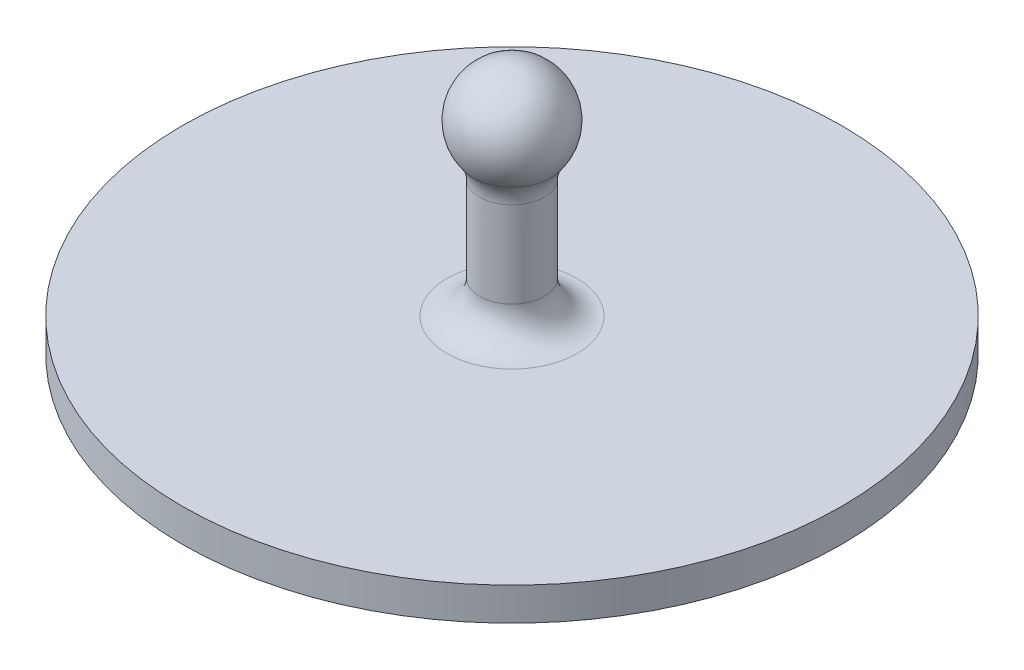
ISO-10303-21;
HEADER;
FILE_DESCRIPTION(('STEP AP214'),'2;1');
FILE_NAME('part.step','',(''),(''),'','','');
FILE_SCHEMA(('AUTOMOTIVE_DESIGN { 1 0 10303 214 1 1 1 1 }'));
ENDSEC;
DATA;
#1=APPLICATION_CONTEXT('core data for automotive mechanical design processes');
#2=APPLICATION_PROTOCOL_DEFINITION('international standard','automotive_design',2000,#1);
#3=PRODUCT_CONTEXT('',#1,'mechanical');
#4=PRODUCT('Part','Part','',(#3));
#5=PRODUCT_RELATED_PRODUCT_CATEGORY('part','',(#4));
#6=PRODUCT_DEFINITION_FORMATION('','',#4);
#7=PRODUCT_DEFINITION_CONTEXT('part definition',#1,'design');
#8=PRODUCT_DEFINITION('design','',#6,#7);
#9=PRODUCT_DEFINITION_SHAPE('','',#8);
#10=(LENGTH_UNIT() NAMED_UNIT(*) SI_UNIT(.MILLI.,.METRE.));
#11=(NAMED_UNIT(*) PLANE_ANGLE_UNIT() SI_UNIT($,.RADIAN.));
#12=(NAMED_UNIT(*) SI_UNIT($,.STERADIAN.) SOLID_ANGLE_UNIT());
#13=UNCERTAINTY_MEASURE_WITH_UNIT(LENGTH_MEASURE(1.E-05),#10,'distance_accuracy_value','');
#14=(GEOMETRIC_REPRESENTATION_CONTEXT(3) GLOBAL_UNCERTAINTY_ASSIGNED_CONTEXT((#13)) GLOBAL_UNIT_ASSIGNED_CONTEXT((#10,
#11,#12)) REPRESENTATION_CONTEXT('',''));
#15=CARTESIAN_POINT('',(0.,0.,0.));
#16=DIRECTION('',(0.,0.,1.));
#17=DIRECTION('',(1.,0.,0.));
#18=AXIS2_PLACEMENT_3D('',#15,#16,#17);
#19=CARTESIAN_POINT('',(0.,8.,0.));
#20=DIRECTION('',(0.,-1.,0.));
#21=DIRECTION('',(0.,0.,-1.));
#22=AXIS2_PLACEMENT_3D('',#19,#20,#21);
#23=CYLINDRICAL_SURFACE('',#22,1.95);
#24=CARTESIAN_POINT('',(0.,7.21152679316063,0.));
#25=DIRECTION('',(0.,1.,0.));
#26=DIRECTION('',(0.,0.,1.));
#27=AXIS2_PLACEMENT_3D('',#24,#25,#26);
#28=CIRCLE('',#27,1.95);
#29=CARTESIAN_POINT('',(0.,7.21152679316063,1.95));
#30=VERTEX_POINT('',#29);
#31=EDGE_CURVE('E46',#30,#30,#28,.F.);
#32=ORIENTED_EDGE('',*,*,#31,.T.);
#33=EDGE_LOOP('',(#32));
#34=FACE_BOUND('',#33,.T.);
#35=CARTESIAN_POINT('',(0.,2.,0.));
#36=DIRECTION('',(0.,-1.,0.));
#37=DIRECTION('',(0.,0.,-1.));
#38=AXIS2_PLACEMENT_3D('',#35,#36,#37);
#39=CIRCLE('',#38,1.95);
#40=CARTESIAN_POINT('',(0.,2.,-1.95));
#41=VERTEX_POINT('',#40);
#42=EDGE_CURVE('E49',#41,#41,#39,.F.);
#43=ORIENTED_EDGE('',*,*,#42,.T.);
#44=EDGE_LOOP('',(#43));
#45=FACE_BOUND('',#44,.T.);
#46=ADVANCED_FACE('F39',(#34,#45),#23,.T.);
#47=CARTESIAN_POINT('',(0.,10.2912735849057,0.));
#48=DIRECTION('',(0.,0.,1.));
#49=DIRECTION('',(1.,0.,0.));
#50=AXIS2_PLACEMENT_3D('',#47,#48,#49);
#51=SPHERICAL_SURFACE('',#50,3.00872641509434);
#52=CARTESIAN_POINT('',(0.,10.2912735849057,0.));
#53=DIRECTION('',(0.,1.,0.));
#54=DIRECTION('',(0.,0.,1.));
#55=AXIS2_PLACEMENT_3D('',#52,#53,#54);
#56=SPHERICAL_SURFACE('',#55,3.00872641509434);
#57=CARTESIAN_POINT('',(0.,8.44127924378915,0.));
#58=DIRECTION('',(0.,1.,0.));
#59=DIRECTION('',(0.,0.,1.));
#60=AXIS2_PLACEMENT_3D('',#57,#58,#59);
#61=CIRCLE('',#60,2.37275274285445);
#62=CARTESIAN_POINT('',(0.,8.44127924378915,2.37275274285445));
#63=VERTEX_POINT('',#62);
#64=EDGE_CURVE('E53',#63,#63,#61,.T.);
#65=ORIENTED_EDGE('',*,*,#64,.T.);
#66=EDGE_LOOP('',(#65));
#67=FACE_BOUND('',#66,.T.);
#68=ADVANCED_FACE('F86',(#67),#56,.T.);
#69=CARTESIAN_POINT('',(0.,-2.,0.));
#70=DIRECTION('',(0.,1.,0.));
#71=DIRECTION('',(0.,0.,1.));
#72=AXIS2_PLACEMENT_3D('',#69,#70,#71);
#73=CYLINDRICAL_SURFACE('',#72,20.);
#74=CARTESIAN_POINT('',(0.,-2.,0.));
#75=DIRECTION('',(0.,-1.,0.));
#76=DIRECTION('',(0.,0.,-1.));
#77=AXIS2_PLACEMENT_3D('',#74,#75,#76);
#78=CIRCLE('',#77,20.);
#79=CARTESIAN_POINT('',(0.,-2.,-20.));
#80=VERTEX_POINT('',#79);
#81=EDGE_CURVE('E56',#80,#80,#78,.T.);
#82=ORIENTED_EDGE('',*,*,#81,.F.);
#83=EDGE_LOOP('',(#82));
#84=FACE_BOUND('',#83,.T.);
#85=CARTESIAN_POINT('',(0.,0.,0.));
#86=DIRECTION('',(0.,-1.,0.));
#87=DIRECTION('',(0.,0.,-1.));
#88=AXIS2_PLACEMENT_3D('',#85,#86,#87);
#89=CIRCLE('',#88,20.);
#90=CARTESIAN_POINT('',(0.,0.,-20.));
#91=VERTEX_POINT('',#90);
#92=EDGE_CURVE('E58',#91,#91,#89,.T.);
#93=ORIENTED_EDGE('',*,*,#92,.T.);
#94=EDGE_LOOP('',(#93));
#95=FACE_BOUND('',#94,.T.);
#96=ADVANCED_FACE('F84',(#84,#95),#73,.T.);
#97=CARTESIAN_POINT('',(0.,-2.,0.));
#98=DIRECTION('',(0.,-1.,0.));
#99=DIRECTION('',(0.,0.,-1.));
#100=AXIS2_PLACEMENT_3D('',#97,#98,#99);
#101=PLANE('',#100);
#102=CARTESIAN_POINT('',(0.,-2.,0.));
#103=DIRECTION('',(0.,-1.,0.));
#104=DIRECTION('',(0.,0.,-1.));
#105=AXIS2_PLACEMENT_3D('',#102,#103,#104);
#106=CIRCLE('',#105,19.);
#107=CARTESIAN_POINT('',(0.,-2.,-19.));
#108=VERTEX_POINT('',#107);
#109=EDGE_CURVE('E68',#108,#108,#106,.T.);
#110=ORIENTED_EDGE('',*,*,#109,.F.);
#111=EDGE_LOOP('',(#110));
#112=FACE_BOUND('',#111,.T.);
#113=ORIENTED_EDGE('',*,*,#81,.T.);
#114=EDGE_LOOP('',(#113));
#115=FACE_BOUND('',#114,.T.);
#116=ADVANCED_FACE('F78',(#112,#115),#101,.T.);
#117=CARTESIAN_POINT('',(0.,0.,0.));
#118=DIRECTION('',(0.,-1.,0.));
#119=DIRECTION('',(0.,0.,-1.));
#120=AXIS2_PLACEMENT_3D('',#117,#118,#119);
#121=PLANE('',#120);
#122=CARTESIAN_POINT('',(0.,0.,0.));
#123=DIRECTION('',(0.,-1.,0.));
#124=DIRECTION('',(0.,0.,-1.));
#125=AXIS2_PLACEMENT_3D('',#122,#123,#124);
#126=CIRCLE('',#125,3.95);
#127=CARTESIAN_POINT('',(0.,0.,-3.95));
#128=VERTEX_POINT('',#127);
#129=EDGE_CURVE('E10',#128,#128,#126,.T.);
#130=ORIENTED_EDGE('',*,*,#129,.T.);
#131=EDGE_LOOP('',(#130));
#132=FACE_BOUND('',#131,.T.);
#133=ORIENTED_EDGE('',*,*,#92,.F.);
#134=EDGE_LOOP('',(#133));
#135=FACE_BOUND('',#134,.T.);
#136=ADVANCED_FACE('F81',(#132,#135),#121,.F.);
#137=CARTESIAN_POINT('',(0.,7.21152679316063,0.));
#138=DIRECTION('',(0.,1.,0.));
#139=DIRECTION('',(0.,0.,1.));
#140=AXIS2_PLACEMENT_3D('',#137,#138,#139);
#141=TOROIDAL_SURFACE('',#140,3.95,2.);
#142=ORIENTED_EDGE('',*,*,#31,.F.);
#143=EDGE_LOOP('',(#142));
#144=FACE_BOUND('',#143,.T.);
#145=ORIENTED_EDGE('',*,*,#64,.F.);
#146=EDGE_LOOP('',(#145));
#147=FACE_BOUND('',#146,.T.);
#148=ADVANCED_FACE('F94',(#144,#147),#141,.F.);
#149=CARTESIAN_POINT('',(0.,2.,0.));
#150=DIRECTION('',(0.,-1.,0.));
#151=DIRECTION('',(0.,0.,-1.));
#152=AXIS2_PLACEMENT_3D('',#149,#150,#151);
#153=TOROIDAL_SURFACE('',#152,3.95,2.);
#154=ORIENTED_EDGE('',*,*,#42,.F.);
#155=EDGE_LOOP('',(#154));
#156=FACE_BOUND('',#155,.T.);
#157=ORIENTED_EDGE('',*,*,#129,.F.);
#158=EDGE_LOOP('',(#157));
#159=FACE_BOUND('',#158,.T.);
#160=ADVANCED_FACE('F41',(#156,#159),#153,.F.);
#161=CARTESIAN_POINT('',(0.,-1.5,0.));
#162=DIRECTION('',(0.,-1.,0.));
#163=DIRECTION('',(0.,0.,-1.));
#164=AXIS2_PLACEMENT_3D('',#161,#162,#163);
#165=CYLINDRICAL_SURFACE('',#164,19.);
#166=CARTESIAN_POINT('',(0.,-1.5,0.));
#167=DIRECTION('',(0.,-1.,0.));
#168=DIRECTION('',(0.,0.,-1.));
#169=AXIS2_PLACEMENT_3D('',#166,#167,#168);
#170=CIRCLE('',#169,19.);
#171=CARTESIAN_POINT('',(0.,-1.5,-19.));
#172=VERTEX_POINT('',#171);
#173=EDGE_CURVE('E61',#172,#172,#170,.T.);
#174=ORIENTED_EDGE('',*,*,#173,.F.);
#175=EDGE_LOOP('',(#174));
#176=FACE_BOUND('',#175,.T.);
#177=ORIENTED_EDGE('',*,*,#109,.T.);
#178=EDGE_LOOP('',(#177));
#179=FACE_BOUND('',#178,.T.);
#180=ADVANCED_FACE('F73',(#176,#179),#165,.F.);
#181=CARTESIAN_POINT('',(0.,-1.5,0.));
#182=DIRECTION('',(0.,-1.,0.));
#183=DIRECTION('',(0.,0.,-1.));
#184=AXIS2_PLACEMENT_3D('',#181,#182,#183);
#185=PLANE('',#184);
#186=ORIENTED_EDGE('',*,*,#173,.T.);
#187=EDGE_LOOP('',(#186));
#188=FACE_BOUND('',#187,.T.);
#189=ADVANCED_FACE('F75',(#188),#185,.T.);
#190=CLOSED_SHELL('',(#46,#68,#96,#116,#136,#148,#160,#180,#189));
#191=MANIFOLD_SOLID_BREP('B2',#190);
#192=ADVANCED_BREP_SHAPE_REPRESENTATION('',(#18,#191),#14);
#193=SHAPE_DEFINITION_REPRESENTATION(#9,#192);
ENDSEC;
END-ISO-10303-21;
